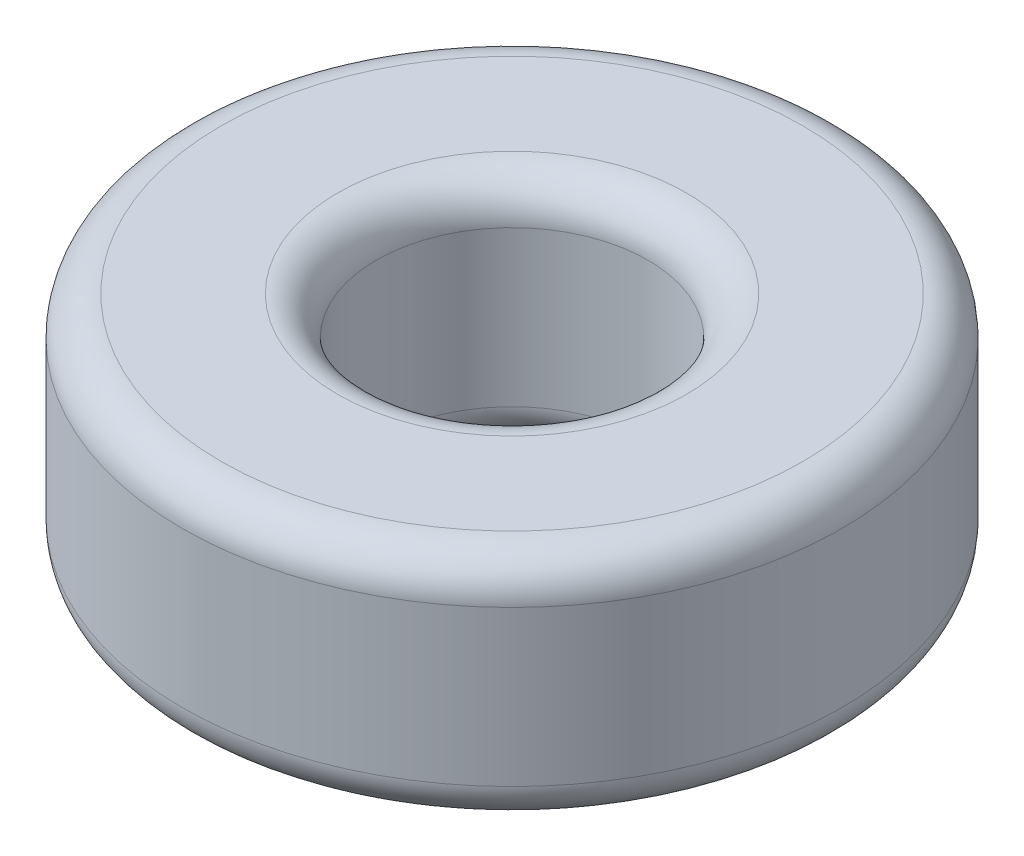
ISO-10303-21;
HEADER;
FILE_DESCRIPTION(('STEP AP214'),'2;1');
FILE_NAME('part.step','',(''),(''),'','','');
FILE_SCHEMA(('AUTOMOTIVE_DESIGN { 1 0 10303 214 1 1 1 1 }'));
ENDSEC;
DATA;
#1=APPLICATION_CONTEXT('core data for automotive mechanical design processes');
#2=APPLICATION_PROTOCOL_DEFINITION('international standard','automotive_design',2000,#1);
#3=PRODUCT_CONTEXT('',#1,'mechanical');
#4=PRODUCT('Part','Part','',(#3));
#5=PRODUCT_RELATED_PRODUCT_CATEGORY('part','',(#4));
#6=PRODUCT_DEFINITION_FORMATION('','',#4);
#7=PRODUCT_DEFINITION_CONTEXT('part definition',#1,'design');
#8=PRODUCT_DEFINITION('design','',#6,#7);
#9=PRODUCT_DEFINITION_SHAPE('','',#8);
#10=(LENGTH_UNIT() NAMED_UNIT(*) SI_UNIT(.MILLI.,.METRE.));
#11=(NAMED_UNIT(*) PLANE_ANGLE_UNIT() SI_UNIT($,.RADIAN.));
#12=(NAMED_UNIT(*) SI_UNIT($,.STERADIAN.) SOLID_ANGLE_UNIT());
#13=UNCERTAINTY_MEASURE_WITH_UNIT(LENGTH_MEASURE(1.E-05),#10,'distance_accuracy_value','');
#14=(GEOMETRIC_REPRESENTATION_CONTEXT(3) GLOBAL_UNCERTAINTY_ASSIGNED_CONTEXT((#13)) GLOBAL_UNIT_ASSIGNED_CONTEXT((#10,
#11,#12)) REPRESENTATION_CONTEXT('',''));
#15=CARTESIAN_POINT('',(0.,0.,0.));
#16=DIRECTION('',(0.,0.,1.));
#17=DIRECTION('',(1.,0.,0.));
#18=AXIS2_PLACEMENT_3D('',#15,#16,#17);
#19=CARTESIAN_POINT('',(0.,6.,0.));
#20=DIRECTION('',(0.,1.,0.));
#21=DIRECTION('',(0.,0.,1.));
#22=AXIS2_PLACEMENT_3D('',#19,#20,#21);
#23=PLANE('',#22);
#24=CARTESIAN_POINT('',(0.,6.,0.));
#25=DIRECTION('',(0.,1.,0.));
#26=DIRECTION('',(0.,0.,1.));
#27=AXIS2_PLACEMENT_3D('',#24,#25,#26);
#28=CIRCLE('',#27,4.5);
#29=CARTESIAN_POINT('',(0.,6.,4.5));
#30=VERTEX_POINT('',#29);
#31=EDGE_CURVE('E55',#30,#30,#28,.F.);
#32=ORIENTED_EDGE('',*,*,#31,.T.);
#33=EDGE_LOOP('',(#32));
#34=FACE_BOUND('',#33,.T.);
#35=CARTESIAN_POINT('',(0.,6.,0.));
#36=DIRECTION('',(0.,1.,0.));
#37=DIRECTION('',(0.,0.,1.));
#38=AXIS2_PLACEMENT_3D('',#35,#36,#37);
#39=CIRCLE('',#38,7.5);
#40=CARTESIAN_POINT('',(0.,6.,7.5));
#41=VERTEX_POINT('',#40);
#42=EDGE_CURVE('E61',#41,#41,#39,.T.);
#43=ORIENTED_EDGE('',*,*,#42,.T.);
#44=EDGE_LOOP('',(#43));
#45=FACE_BOUND('',#44,.T.);
#46=ADVANCED_FACE('F37',(#34,#45),#23,.T.);
#47=CARTESIAN_POINT('',(0.,0.,0.));
#48=DIRECTION('',(0.,1.,0.));
#49=DIRECTION('',(0.,0.,1.));
#50=AXIS2_PLACEMENT_3D('',#47,#48,#49);
#51=PLANE('',#50);
#52=CARTESIAN_POINT('',(0.,0.,0.));
#53=DIRECTION('',(0.,1.,0.));
#54=DIRECTION('',(0.,0.,1.));
#55=AXIS2_PLACEMENT_3D('',#52,#53,#54);
#56=CIRCLE('',#55,7.5);
#57=CARTESIAN_POINT('',(0.,0.,7.5));
#58=VERTEX_POINT('',#57);
#59=EDGE_CURVE('E10',#58,#58,#56,.F.);
#60=ORIENTED_EDGE('',*,*,#59,.T.);
#61=EDGE_LOOP('',(#60));
#62=FACE_BOUND('',#61,.T.);
#63=CARTESIAN_POINT('',(0.,0.,0.));
#64=DIRECTION('',(0.,1.,0.));
#65=DIRECTION('',(0.,0.,1.));
#66=AXIS2_PLACEMENT_3D('',#63,#64,#65);
#67=CIRCLE('',#66,4.5);
#68=CARTESIAN_POINT('',(0.,0.,4.5));
#69=VERTEX_POINT('',#68);
#70=EDGE_CURVE('E73',#69,#69,#67,.T.);
#71=ORIENTED_EDGE('',*,*,#70,.T.);
#72=EDGE_LOOP('',(#71));
#73=FACE_BOUND('',#72,.T.);
#74=ADVANCED_FACE('F78',(#62,#73),#51,.F.);
#75=CARTESIAN_POINT('',(0.,6.,0.));
#76=DIRECTION('',(0.,-1.,0.));
#77=DIRECTION('',(0.,0.,-1.));
#78=AXIS2_PLACEMENT_3D('',#75,#76,#77);
#79=CYLINDRICAL_SURFACE('',#78,8.5);
#80=CARTESIAN_POINT('',(0.,1.,0.));
#81=DIRECTION('',(0.,1.,0.));
#82=DIRECTION('',(0.,0.,1.));
#83=AXIS2_PLACEMENT_3D('',#80,#81,#82);
#84=CIRCLE('',#83,8.5);
#85=CARTESIAN_POINT('',(0.,1.,8.5));
#86=VERTEX_POINT('',#85);
#87=EDGE_CURVE('E45',#86,#86,#84,.T.);
#88=ORIENTED_EDGE('',*,*,#87,.T.);
#89=EDGE_LOOP('',(#88));
#90=FACE_BOUND('',#89,.T.);
#91=CARTESIAN_POINT('',(0.,5.,0.));
#92=DIRECTION('',(0.,1.,0.));
#93=DIRECTION('',(0.,0.,1.));
#94=AXIS2_PLACEMENT_3D('',#91,#92,#93);
#95=CIRCLE('',#94,8.5);
#96=CARTESIAN_POINT('',(0.,5.,8.5));
#97=VERTEX_POINT('',#96);
#98=EDGE_CURVE('E50',#97,#97,#95,.F.);
#99=ORIENTED_EDGE('',*,*,#98,.T.);
#100=EDGE_LOOP('',(#99));
#101=FACE_BOUND('',#100,.T.);
#102=ADVANCED_FACE('F93',(#90,#101),#79,.T.);
#103=CARTESIAN_POINT('',(0.,6.,0.));
#104=DIRECTION('',(0.,-1.,0.));
#105=DIRECTION('',(0.,0.,-1.));
#106=AXIS2_PLACEMENT_3D('',#103,#104,#105);
#107=CYLINDRICAL_SURFACE('',#106,3.5);
#108=CARTESIAN_POINT('',(0.,1.,0.));
#109=DIRECTION('',(0.,1.,0.));
#110=DIRECTION('',(0.,0.,1.));
#111=AXIS2_PLACEMENT_3D('',#108,#109,#110);
#112=CIRCLE('',#111,3.5);
#113=CARTESIAN_POINT('',(0.,1.,3.5));
#114=VERTEX_POINT('',#113);
#115=EDGE_CURVE('E65',#114,#114,#112,.F.);
#116=ORIENTED_EDGE('',*,*,#115,.T.);
#117=EDGE_LOOP('',(#116));
#118=FACE_BOUND('',#117,.T.);
#119=CARTESIAN_POINT('',(0.,5.,0.));
#120=DIRECTION('',(0.,1.,0.));
#121=DIRECTION('',(0.,0.,1.));
#122=AXIS2_PLACEMENT_3D('',#119,#120,#121);
#123=CIRCLE('',#122,3.5);
#124=CARTESIAN_POINT('',(0.,5.,3.5));
#125=VERTEX_POINT('',#124);
#126=EDGE_CURVE('E69',#125,#125,#123,.T.);
#127=ORIENTED_EDGE('',*,*,#126,.T.);
#128=EDGE_LOOP('',(#127));
#129=FACE_BOUND('',#128,.T.);
#130=ADVANCED_FACE('F83',(#118,#129),#107,.F.);
#131=CARTESIAN_POINT('',(0.,1.,0.));
#132=DIRECTION('',(0.,1.,0.));
#133=DIRECTION('',(0.,0.,1.));
#134=AXIS2_PLACEMENT_3D('',#131,#132,#133);
#135=TOROIDAL_SURFACE('',#134,4.5,1.);
#136=ORIENTED_EDGE('',*,*,#115,.F.);
#137=EDGE_LOOP('',(#136));
#138=FACE_BOUND('',#137,.T.);
#139=ORIENTED_EDGE('',*,*,#70,.F.);
#140=EDGE_LOOP('',(#139));
#141=FACE_BOUND('',#140,.T.);
#142=ADVANCED_FACE('F80',(#138,#141),#135,.T.);
#143=CARTESIAN_POINT('',(0.,5.,0.));
#144=DIRECTION('',(0.,1.,0.));
#145=DIRECTION('',(0.,0.,1.));
#146=AXIS2_PLACEMENT_3D('',#143,#144,#145);
#147=TOROIDAL_SURFACE('',#146,4.5,1.);
#148=ORIENTED_EDGE('',*,*,#31,.F.);
#149=EDGE_LOOP('',(#148));
#150=FACE_BOUND('',#149,.T.);
#151=ORIENTED_EDGE('',*,*,#126,.F.);
#152=EDGE_LOOP('',(#151));
#153=FACE_BOUND('',#152,.T.);
#154=ADVANCED_FACE('F82',(#150,#153),#147,.T.);
#155=CARTESIAN_POINT('',(0.,5.,0.));
#156=DIRECTION('',(0.,1.,0.));
#157=DIRECTION('',(0.,0.,1.));
#158=AXIS2_PLACEMENT_3D('',#155,#156,#157);
#159=TOROIDAL_SURFACE('',#158,7.5,1.);
#160=ORIENTED_EDGE('',*,*,#98,.F.);
#161=EDGE_LOOP('',(#160));
#162=FACE_BOUND('',#161,.T.);
#163=ORIENTED_EDGE('',*,*,#42,.F.);
#164=EDGE_LOOP('',(#163));
#165=FACE_BOUND('',#164,.T.);
#166=ADVANCED_FACE('F90',(#162,#165),#159,.T.);
#167=CARTESIAN_POINT('',(0.,1.,0.));
#168=DIRECTION('',(0.,1.,0.));
#169=DIRECTION('',(0.,0.,1.));
#170=AXIS2_PLACEMENT_3D('',#167,#168,#169);
#171=TOROIDAL_SURFACE('',#170,7.5,1.);
#172=ORIENTED_EDGE('',*,*,#59,.F.);
#173=EDGE_LOOP('',(#172));
#174=FACE_BOUND('',#173,.T.);
#175=ORIENTED_EDGE('',*,*,#87,.F.);
#176=EDGE_LOOP('',(#175));
#177=FACE_BOUND('',#176,.T.);
#178=ADVANCED_FACE('F39',(#174,#177),#171,.T.);
#179=CLOSED_SHELL('',(#46,#74,#102,#130,#142,#154,#166,#178));
#180=MANIFOLD_SOLID_BREP('B2',#179);
#181=ADVANCED_BREP_SHAPE_REPRESENTATION('',(#18,#180),#14);
#182=SHAPE_DEFINITION_REPRESENTATION(#9,#181);
ENDSEC;
END-ISO-10303-21;
